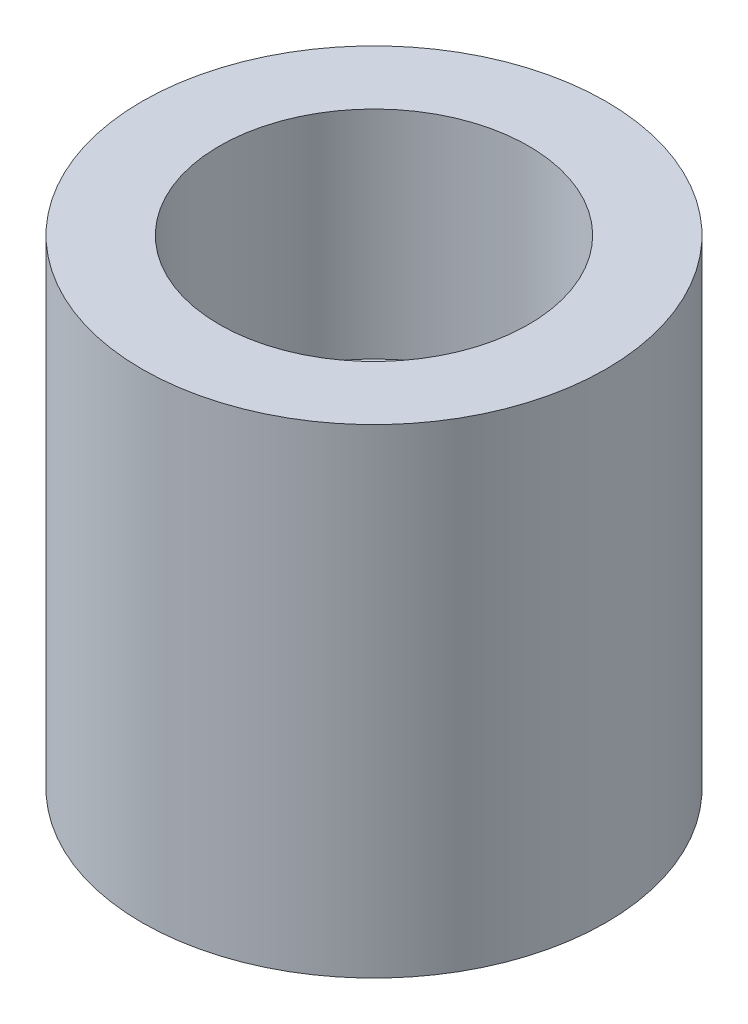
ISO-10303-21;
HEADER;
FILE_DESCRIPTION(('STEP AP214'),'2;1');
FILE_NAME('part.step','',(''),(''),'','','');
FILE_SCHEMA(('AUTOMOTIVE_DESIGN { 1 0 10303 214 1 1 1 1 }'));
ENDSEC;
DATA;
#1=APPLICATION_CONTEXT('core data for automotive mechanical design processes');
#2=APPLICATION_PROTOCOL_DEFINITION('international standard','automotive_design',2000,#1);
#3=PRODUCT_CONTEXT('',#1,'mechanical');
#4=PRODUCT('Part','Part','',(#3));
#5=PRODUCT_RELATED_PRODUCT_CATEGORY('part','',(#4));
#6=PRODUCT_DEFINITION_FORMATION('','',#4);
#7=PRODUCT_DEFINITION_CONTEXT('part definition',#1,'design');
#8=PRODUCT_DEFINITION('design','',#6,#7);
#9=PRODUCT_DEFINITION_SHAPE('','',#8);
#10=(LENGTH_UNIT() NAMED_UNIT(*) SI_UNIT(.MILLI.,.METRE.));
#11=(NAMED_UNIT(*) PLANE_ANGLE_UNIT() SI_UNIT($,.RADIAN.));
#12=(NAMED_UNIT(*) SI_UNIT($,.STERADIAN.) SOLID_ANGLE_UNIT());
#13=UNCERTAINTY_MEASURE_WITH_UNIT(LENGTH_MEASURE(1.E-05),#10,'distance_accuracy_value','');
#14=(GEOMETRIC_REPRESENTATION_CONTEXT(3) GLOBAL_UNCERTAINTY_ASSIGNED_CONTEXT((#13)) GLOBAL_UNIT_ASSIGNED_CONTEXT((#10,
#11,#12)) REPRESENTATION_CONTEXT('',''));
#15=CARTESIAN_POINT('',(0.,0.,0.));
#16=DIRECTION('',(0.,0.,1.));
#17=DIRECTION('',(1.,0.,0.));
#18=AXIS2_PLACEMENT_3D('',#15,#16,#17);
#19=CARTESIAN_POINT('',(0.,15.5,0.));
#20=DIRECTION('',(0.,-1.,0.));
#21=DIRECTION('',(0.,0.,-1.));
#22=AXIS2_PLACEMENT_3D('',#19,#20,#21);
#23=CYLINDRICAL_SURFACE('',#22,7.5);
#24=CARTESIAN_POINT('',(0.,15.5,0.));
#25=DIRECTION('',(0.,1.,0.));
#26=DIRECTION('',(0.,0.,1.));
#27=AXIS2_PLACEMENT_3D('',#24,#25,#26);
#28=CIRCLE('',#27,7.5);
#29=CARTESIAN_POINT('',(0.,15.5,7.5));
#30=VERTEX_POINT('',#29);
#31=EDGE_CURVE('E10',#30,#30,#28,.T.);
#32=ORIENTED_EDGE('',*,*,#31,.F.);
#33=EDGE_LOOP('',(#32));
#34=FACE_BOUND('',#33,.T.);
#35=CARTESIAN_POINT('',(0.,0.,0.));
#36=DIRECTION('',(0.,1.,0.));
#37=DIRECTION('',(0.,0.,1.));
#38=AXIS2_PLACEMENT_3D('',#35,#36,#37);
#39=CIRCLE('',#38,7.5);
#40=CARTESIAN_POINT('',(0.,0.,7.5));
#41=VERTEX_POINT('',#40);
#42=EDGE_CURVE('E34',#41,#41,#39,.T.);
#43=ORIENTED_EDGE('',*,*,#42,.T.);
#44=EDGE_LOOP('',(#43));
#45=FACE_BOUND('',#44,.T.);
#46=ADVANCED_FACE('F31',(#34,#45),#23,.T.);
#47=CARTESIAN_POINT('',(0.,15.5,0.));
#48=DIRECTION('',(0.,1.,0.));
#49=DIRECTION('',(0.,0.,1.));
#50=AXIS2_PLACEMENT_3D('',#47,#48,#49);
#51=PLANE('',#50);
#52=CARTESIAN_POINT('',(0.,15.5,0.));
#53=DIRECTION('',(0.,1.,0.));
#54=DIRECTION('',(0.,0.,1.));
#55=AXIS2_PLACEMENT_3D('',#52,#53,#54);
#56=CIRCLE('',#55,5.);
#57=CARTESIAN_POINT('',(0.,15.5,5.));
#58=VERTEX_POINT('',#57);
#59=EDGE_CURVE('E43',#58,#58,#56,.T.);
#60=ORIENTED_EDGE('',*,*,#59,.F.);
#61=EDGE_LOOP('',(#60));
#62=FACE_BOUND('',#61,.T.);
#63=ORIENTED_EDGE('',*,*,#31,.T.);
#64=EDGE_LOOP('',(#63));
#65=FACE_BOUND('',#64,.T.);
#66=ADVANCED_FACE('F58',(#62,#65),#51,.T.);
#67=CARTESIAN_POINT('',(0.,0.,0.));
#68=DIRECTION('',(0.,1.,0.));
#69=DIRECTION('',(0.,0.,1.));
#70=AXIS2_PLACEMENT_3D('',#67,#68,#69);
#71=PLANE('',#70);
#72=ORIENTED_EDGE('',*,*,#42,.F.);
#73=EDGE_LOOP('',(#72));
#74=FACE_BOUND('',#73,.T.);
#75=ADVANCED_FACE('F54',(#74),#71,.F.);
#76=CARTESIAN_POINT('',(0.,8.5,0.));
#77=DIRECTION('',(0.,1.,0.));
#78=DIRECTION('',(0.,0.,1.));
#79=AXIS2_PLACEMENT_3D('',#76,#77,#78);
#80=CYLINDRICAL_SURFACE('',#79,5.);
#81=CARTESIAN_POINT('',(0.,8.5,0.));
#82=DIRECTION('',(0.,1.,0.));
#83=DIRECTION('',(0.,0.,1.));
#84=AXIS2_PLACEMENT_3D('',#81,#82,#83);
#85=CIRCLE('',#84,5.);
#86=CARTESIAN_POINT('',(0.,8.5,5.));
#87=VERTEX_POINT('',#86);
#88=EDGE_CURVE('E41',#87,#87,#85,.T.);
#89=ORIENTED_EDGE('',*,*,#88,.F.);
#90=EDGE_LOOP('',(#89));
#91=FACE_BOUND('',#90,.T.);
#92=ORIENTED_EDGE('',*,*,#59,.T.);
#93=EDGE_LOOP('',(#92));
#94=FACE_BOUND('',#93,.T.);
#95=ADVANCED_FACE('F51',(#91,#94),#80,.F.);
#96=CARTESIAN_POINT('',(0.,8.5,0.));
#97=DIRECTION('',(0.,1.,0.));
#98=DIRECTION('',(0.,0.,1.));
#99=AXIS2_PLACEMENT_3D('',#96,#97,#98);
#100=PLANE('',#99);
#101=ORIENTED_EDGE('',*,*,#88,.T.);
#102=EDGE_LOOP('',(#101));
#103=FACE_BOUND('',#102,.T.);
#104=ADVANCED_FACE('F49',(#103),#100,.T.);
#105=CLOSED_SHELL('',(#46,#66,#75,#95,#104));
#106=MANIFOLD_SOLID_BREP('B2',#105);
#107=ADVANCED_BREP_SHAPE_REPRESENTATION('',(#18,#106),#14);
#108=SHAPE_DEFINITION_REPRESENTATION(#9,#107);
ENDSEC;
END-ISO-10303-21;
